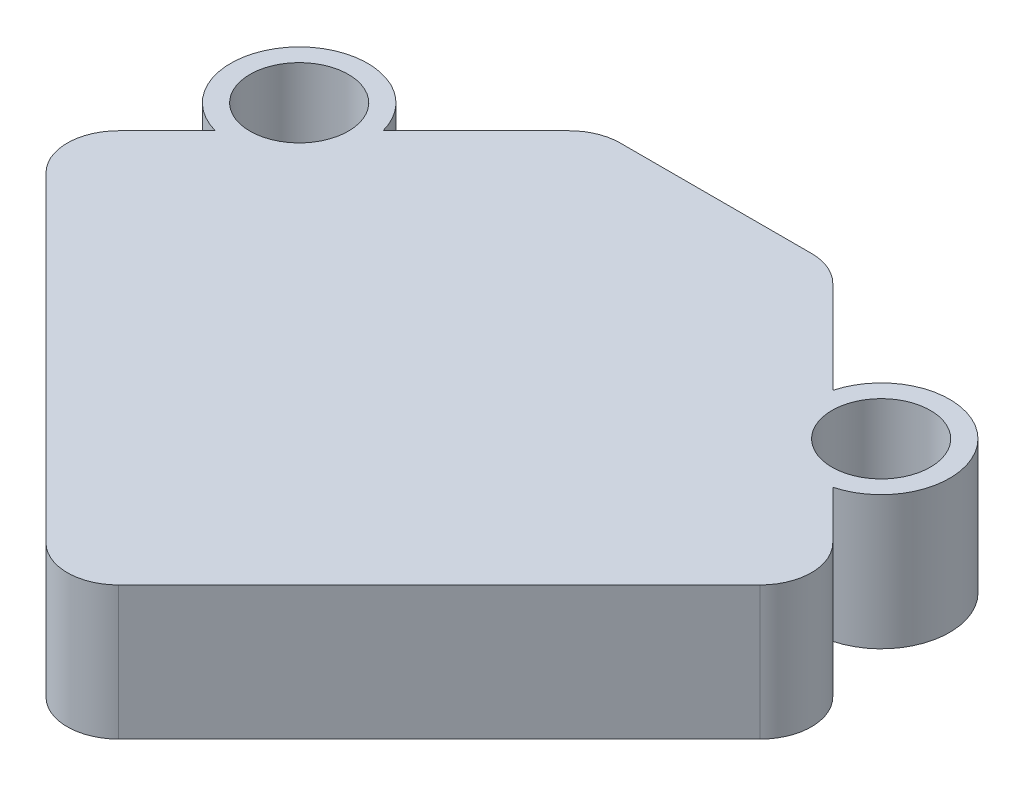
ISO-10303-21;
HEADER;
FILE_DESCRIPTION(('STEP AP214'),'2;1');
FILE_NAME('part.step','',(''),(''),'','','');
FILE_SCHEMA(('AUTOMOTIVE_DESIGN { 1 0 10303 214 1 1 1 1 }'));
ENDSEC;
DATA;
#1=APPLICATION_CONTEXT('core data for automotive mechanical design processes');
#2=APPLICATION_PROTOCOL_DEFINITION('international standard','automotive_design',2000,#1);
#3=PRODUCT_CONTEXT('',#1,'mechanical');
#4=PRODUCT('Part','Part','',(#3));
#5=PRODUCT_RELATED_PRODUCT_CATEGORY('part','',(#4));
#6=PRODUCT_DEFINITION_FORMATION('','',#4);
#7=PRODUCT_DEFINITION_CONTEXT('part definition',#1,'design');
#8=PRODUCT_DEFINITION('design','',#6,#7);
#9=PRODUCT_DEFINITION_SHAPE('','',#8);
#10=(LENGTH_UNIT() NAMED_UNIT(*) SI_UNIT(.MILLI.,.METRE.));
#11=(NAMED_UNIT(*) PLANE_ANGLE_UNIT() SI_UNIT($,.RADIAN.));
#12=(NAMED_UNIT(*) SI_UNIT($,.STERADIAN.) SOLID_ANGLE_UNIT());
#13=UNCERTAINTY_MEASURE_WITH_UNIT(LENGTH_MEASURE(1.E-05),#10,'distance_accuracy_value','');
#14=(GEOMETRIC_REPRESENTATION_CONTEXT(3) GLOBAL_UNCERTAINTY_ASSIGNED_CONTEXT((#13)) GLOBAL_UNIT_ASSIGNED_CONTEXT((#10,
#11,#12)) REPRESENTATION_CONTEXT('',''));
#15=CARTESIAN_POINT('',(0.,0.,0.));
#16=DIRECTION('',(0.,0.,1.));
#17=DIRECTION('',(1.,0.,0.));
#18=AXIS2_PLACEMENT_3D('',#15,#16,#17);
#19=CARTESIAN_POINT('',(17.,7.,-8.80939751330899));
#20=DIRECTION('',(0.,-1.,0.));
#21=DIRECTION('',(0.,0.,-1.));
#22=AXIS2_PLACEMENT_3D('',#19,#20,#21);
#23=CYLINDRICAL_SURFACE('',#22,1.75);
#24=CARTESIAN_POINT('',(17.,0.,-8.80939751330899));
#25=DIRECTION('',(0.,1.,0.));
#26=DIRECTION('',(0.,0.,1.));
#27=AXIS2_PLACEMENT_3D('',#24,#25,#26);
#28=CIRCLE('',#27,1.75);
#29=CARTESIAN_POINT('',(17.,0.,-7.05939751330899));
#30=VERTEX_POINT('',#29);
#31=EDGE_CURVE('E330',#30,#30,#28,.F.);
#32=ORIENTED_EDGE('',*,*,#31,.T.);
#33=EDGE_LOOP('',(#32));
#34=FACE_BOUND('',#33,.T.);
#35=CARTESIAN_POINT('',(17.,2.,-8.80939751330899));
#36=DIRECTION('',(0.,1.,0.));
#37=DIRECTION('',(0.,0.,1.));
#38=AXIS2_PLACEMENT_3D('',#35,#36,#37);
#39=CIRCLE('',#38,1.75);
#40=CARTESIAN_POINT('',(17.,2.,-7.05939751330899));
#41=VERTEX_POINT('',#40);
#42=EDGE_CURVE('E224',#41,#41,#39,.F.);
#43=ORIENTED_EDGE('',*,*,#42,.F.);
#44=EDGE_LOOP('',(#43));
#45=FACE_BOUND('',#44,.T.);
#46=ADVANCED_FACE('F35',(#34,#45),#23,.F.);
#47=CARTESIAN_POINT('',(-17.,7.,-8.80939751330899));
#48=DIRECTION('',(0.,-1.,0.));
#49=DIRECTION('',(0.,0.,-1.));
#50=AXIS2_PLACEMENT_3D('',#47,#48,#49);
#51=CYLINDRICAL_SURFACE('',#50,1.75);
#52=CARTESIAN_POINT('',(-17.,0.,-8.80939751330899));
#53=DIRECTION('',(0.,1.,0.));
#54=DIRECTION('',(0.,0.,1.));
#55=AXIS2_PLACEMENT_3D('',#52,#53,#54);
#56=CIRCLE('',#55,1.75);
#57=CARTESIAN_POINT('',(-17.,0.,-7.05939751330899));
#58=VERTEX_POINT('',#57);
#59=EDGE_CURVE('E239',#58,#58,#56,.T.);
#60=ORIENTED_EDGE('',*,*,#59,.F.);
#61=EDGE_LOOP('',(#60));
#62=FACE_BOUND('',#61,.T.);
#63=CARTESIAN_POINT('',(-17.,2.,-8.80939751330899));
#64=DIRECTION('',(0.,1.,0.));
#65=DIRECTION('',(0.,0.,1.));
#66=AXIS2_PLACEMENT_3D('',#63,#64,#65);
#67=CIRCLE('',#66,1.75);
#68=CARTESIAN_POINT('',(-17.,2.,-7.05939751330899));
#69=VERTEX_POINT('',#68);
#70=EDGE_CURVE('E228',#69,#69,#67,.T.);
#71=ORIENTED_EDGE('',*,*,#70,.T.);
#72=EDGE_LOOP('',(#71));
#73=FACE_BOUND('',#72,.T.);
#74=ADVANCED_FACE('F409',(#62,#73),#51,.F.);
#75=CARTESIAN_POINT('',(-10.0762716319083,7.,-10.0762716319083));
#76=DIRECTION('',(-0.707106781186548,0.,-0.707106781186547));
#77=DIRECTION('',(-0.707106781186547,0.,0.707106781186548));
#78=AXIS2_PLACEMENT_3D('',#75,#76,#77);
#79=PLANE('',#78);
#80=DIRECTION('',(0.707106781186547,0.,-0.707106781186548));
#81=VECTOR('',#80,1.);
#82=CARTESIAN_POINT('',(-10.0762716319083,0.,-10.0762716319083));
#83=LINE('',#82,#81);
#84=CARTESIAN_POINT('',(-20.1525432638166,0.,0.));
#85=VERTEX_POINT('',#84);
#86=CARTESIAN_POINT('',(-4.00000000000002,0.,-16.1525432638166));
#87=VERTEX_POINT('',#86);
#88=EDGE_CURVE('E319',#85,#87,#83,.T.);
#89=ORIENTED_EDGE('',*,*,#88,.T.);
#90=DIRECTION('',(0.,-1.,0.));
#91=VECTOR('',#90,1.);
#92=CARTESIAN_POINT('',(-4.00000000000002,-0.00100000000000013,-16.1525432638166));
#93=LINE('',#92,#91);
#94=CARTESIAN_POINT('',(-4.00000000000002,7.,-16.1525432638166));
#95=VERTEX_POINT('',#94);
#96=EDGE_CURVE('E220',#95,#87,#93,.T.);
#97=ORIENTED_EDGE('',*,*,#96,.F.);
#98=DIRECTION('',(0.707106781186547,0.,-0.707106781186548));
#99=VECTOR('',#98,1.);
#100=CARTESIAN_POINT('',(-10.0762716319083,7.,-10.0762716319083));
#101=LINE('',#100,#99);
#102=CARTESIAN_POINT('',(-20.1525432638166,7.,0.));
#103=VERTEX_POINT('',#102);
#104=EDGE_CURVE('E234',#103,#95,#101,.T.);
#105=ORIENTED_EDGE('',*,*,#104,.F.);
#106=DIRECTION('',(0.,-1.,0.));
#107=VECTOR('',#106,1.);
#108=CARTESIAN_POINT('',(-20.1525432638166,7.,0.));
#109=LINE('',#108,#107);
#110=EDGE_CURVE('E189',#103,#85,#109,.T.);
#111=ORIENTED_EDGE('',*,*,#110,.T.);
#112=EDGE_LOOP('',(#89,#97,#105,#111));
#113=FACE_BOUND('',#112,.T.);
#114=ADVANCED_FACE('F374',(#113),#79,.F.);
#115=CARTESIAN_POINT('',(10.0762716319083,7.,-10.0762716319083));
#116=DIRECTION('',(0.707106781186547,0.,-0.707106781186547));
#117=DIRECTION('',(-0.707106781186548,0.,-0.707106781186548));
#118=AXIS2_PLACEMENT_3D('',#115,#116,#117);
#119=PLANE('',#118);
#120=DIRECTION('',(0.707106781186548,0.,0.707106781186548));
#121=VECTOR('',#120,1.);
#122=CARTESIAN_POINT('',(10.0762716319083,7.,-10.0762716319083));
#123=LINE('',#122,#121);
#124=CARTESIAN_POINT('',(3.99999999999998,7.,-16.1525432638166));
#125=VERTEX_POINT('',#124);
#126=CARTESIAN_POINT('',(20.1525432638166,7.,0.));
#127=VERTEX_POINT('',#126);
#128=EDGE_CURVE('E238',#125,#127,#123,.T.);
#129=ORIENTED_EDGE('',*,*,#128,.F.);
#130=DIRECTION('',(0.,1.,0.));
#131=VECTOR('',#130,1.);
#132=CARTESIAN_POINT('',(3.99999999999998,-0.00100000000000013,-16.1525432638166));
#133=LINE('',#132,#131);
#134=CARTESIAN_POINT('',(3.99999999999998,0.,-16.1525432638166));
#135=VERTEX_POINT('',#134);
#136=EDGE_CURVE('E209',#135,#125,#133,.T.);
#137=ORIENTED_EDGE('',*,*,#136,.F.);
#138=DIRECTION('',(0.707106781186548,0.,0.707106781186548));
#139=VECTOR('',#138,1.);
#140=CARTESIAN_POINT('',(10.0762716319083,0.,-10.0762716319083));
#141=LINE('',#140,#139);
#142=CARTESIAN_POINT('',(20.1525432638166,0.,0.));
#143=VERTEX_POINT('',#142);
#144=EDGE_CURVE('E322',#135,#143,#141,.T.);
#145=ORIENTED_EDGE('',*,*,#144,.T.);
#146=DIRECTION('',(0.,-1.,0.));
#147=VECTOR('',#146,1.);
#148=CARTESIAN_POINT('',(20.1525432638166,7.,0.));
#149=LINE('',#148,#147);
#150=EDGE_CURVE('E254',#127,#143,#149,.T.);
#151=ORIENTED_EDGE('',*,*,#150,.F.);
#152=EDGE_LOOP('',(#129,#137,#145,#151));
#153=FACE_BOUND('',#152,.T.);
#154=ADVANCED_FACE('F364',(#153),#119,.F.);
#155=CARTESIAN_POINT('',(10.0762716319083,7.,10.0762716319083));
#156=DIRECTION('',(-0.707106781186548,0.,-0.707106781186548));
#157=DIRECTION('',(-0.707106781186547,0.,0.707106781186548));
#158=AXIS2_PLACEMENT_3D('',#155,#156,#157);
#159=PLANE('',#158);
#160=DIRECTION('',(0.707106781186547,0.,-0.707106781186548));
#161=VECTOR('',#160,1.);
#162=CARTESIAN_POINT('',(10.0762716319083,0.,10.0762716319083));
#163=LINE('',#162,#161);
#164=CARTESIAN_POINT('',(0.,0.,20.1525432638166));
#165=VERTEX_POINT('',#164);
#166=EDGE_CURVE('E324',#165,#143,#163,.T.);
#167=ORIENTED_EDGE('',*,*,#166,.F.);
#168=DIRECTION('',(0.,-1.,0.));
#169=VECTOR('',#168,1.);
#170=CARTESIAN_POINT('',(0.,7.,20.1525432638166));
#171=LINE('',#170,#169);
#172=CARTESIAN_POINT('',(0.,7.,20.1525432638166));
#173=VERTEX_POINT('',#172);
#174=EDGE_CURVE('E336',#173,#165,#171,.T.);
#175=ORIENTED_EDGE('',*,*,#174,.F.);
#176=DIRECTION('',(0.707106781186547,0.,-0.707106781186548));
#177=VECTOR('',#176,1.);
#178=CARTESIAN_POINT('',(10.0762716319083,7.,10.0762716319083));
#179=LINE('',#178,#177);
#180=EDGE_CURVE('E231',#173,#127,#179,.T.);
#181=ORIENTED_EDGE('',*,*,#180,.T.);
#182=ORIENTED_EDGE('',*,*,#150,.T.);
#183=EDGE_LOOP('',(#167,#175,#181,#182));
#184=FACE_BOUND('',#183,.T.);
#185=ADVANCED_FACE('F357',(#184),#159,.T.);
#186=CARTESIAN_POINT('',(-11.4904851942814,7.,-11.4904851942814));
#187=DIRECTION('',(-0.707106781186548,0.,-0.707106781186547));
#188=DIRECTION('',(-0.707106781186547,0.,0.707106781186548));
#189=AXIS2_PLACEMENT_3D('',#186,#187,#188);
#190=PLANE('',#189);
#191=DIRECTION('',(-0.707106781186547,0.,0.707106781186548));
#192=VECTOR('',#191,1.);
#193=CARTESIAN_POINT('',(-11.4904851942814,7.8,-11.4904851942814));
#194=LINE('',#193,#192);
#195=CARTESIAN_POINT('',(-7.70710678118656,7.8,-15.2738636073762));
#196=VERTEX_POINT('',#195);
#197=CARTESIAN_POINT('',(-13.1362966948437,7.8,-9.84467369371908));
#198=VERTEX_POINT('',#197);
#199=EDGE_CURVE('E166',#196,#198,#194,.T.);
#200=ORIENTED_EDGE('',*,*,#199,.F.);
#201=DIRECTION('',(0.,-1.,0.));
#202=VECTOR('',#201,1.);
#203=CARTESIAN_POINT('',(-7.70710678118656,0.,-15.2738636073762));
#204=LINE('',#203,#202);
#205=CARTESIAN_POINT('',(-7.70710678118656,0.,-15.2738636073762));
#206=VERTEX_POINT('',#205);
#207=EDGE_CURVE('E251',#196,#206,#204,.T.);
#208=ORIENTED_EDGE('',*,*,#207,.T.);
#209=DIRECTION('',(0.707106781186547,0.,-0.707106781186548));
#210=VECTOR('',#209,1.);
#211=CARTESIAN_POINT('',(-11.4904851942814,0.,-11.4904851942814));
#212=LINE('',#211,#210);
#213=CARTESIAN_POINT('',(-13.1362966948437,0.,-9.84467369371908));
#214=VERTEX_POINT('',#213);
#215=EDGE_CURVE('E185',#214,#206,#212,.T.);
#216=ORIENTED_EDGE('',*,*,#215,.F.);
#217=DIRECTION('',(0.,-1.,0.));
#218=VECTOR('',#217,1.);
#219=CARTESIAN_POINT('',(-13.1362966948437,7.,-9.84467369371908));
#220=LINE('',#219,#218);
#221=EDGE_CURVE('E182',#198,#214,#220,.T.);
#222=ORIENTED_EDGE('',*,*,#221,.F.);
#223=EDGE_LOOP('',(#200,#208,#216,#222));
#224=FACE_BOUND('',#223,.T.);
#225=ADVANCED_FACE('F183',(#224),#190,.T.);
#226=CARTESIAN_POINT('',(-17.,7.,-8.80939751330899));
#227=DIRECTION('',(0.,-1.,0.));
#228=DIRECTION('',(0.,0.,-1.));
#229=AXIS2_PLACEMENT_3D('',#226,#227,#228);
#230=CYLINDRICAL_SURFACE('',#229,3.99999999999999);
#231=CARTESIAN_POINT('',(-17.,0.,-8.80939751330899));
#232=DIRECTION('',(0.,1.,0.));
#233=DIRECTION('',(0.,0.,1.));
#234=AXIS2_PLACEMENT_3D('',#231,#232,#233);
#235=CIRCLE('',#234,3.99999999999999);
#236=CARTESIAN_POINT('',(-18.0352761804101,0.,-4.94569420815272));
#237=VERTEX_POINT('',#236);
#238=EDGE_CURVE('E308',#214,#237,#235,.T.);
#239=ORIENTED_EDGE('',*,*,#238,.T.);
#240=DIRECTION('',(0.,-1.,0.));
#241=VECTOR('',#240,1.);
#242=CARTESIAN_POINT('',(-18.0352761804101,7.,-4.94569420815272));
#243=LINE('',#242,#241);
#244=CARTESIAN_POINT('',(-18.0352761804101,7.8,-4.94569420815272));
#245=VERTEX_POINT('',#244);
#246=EDGE_CURVE('E190',#245,#237,#243,.T.);
#247=ORIENTED_EDGE('',*,*,#246,.F.);
#248=CARTESIAN_POINT('',(-17.,7.8,-8.80939751330899));
#249=DIRECTION('',(0.,1.,0.));
#250=DIRECTION('',(0.,0.,1.));
#251=AXIS2_PLACEMENT_3D('',#248,#249,#250);
#252=CIRCLE('',#251,3.99999999999999);
#253=EDGE_CURVE('E172',#198,#245,#252,.T.);
#254=ORIENTED_EDGE('',*,*,#253,.F.);
#255=ORIENTED_EDGE('',*,*,#221,.T.);
#256=EDGE_LOOP('',(#239,#247,#254,#255));
#257=FACE_BOUND('',#256,.T.);
#258=ADVANCED_FACE('F192',(#257),#230,.T.);
#259=CARTESIAN_POINT('',(-11.4904851942814,7.,-11.4904851942814));
#260=DIRECTION('',(-0.707106781186548,0.,-0.707106781186547));
#261=DIRECTION('',(-0.707106781186547,0.,0.707106781186548));
#262=AXIS2_PLACEMENT_3D('',#259,#260,#261);
#263=PLANE('',#262);
#264=DIRECTION('',(0.707106781186547,0.,-0.707106781186548));
#265=VECTOR('',#264,1.);
#266=CARTESIAN_POINT('',(-11.4904851942814,0.,-11.4904851942814));
#267=LINE('',#266,#265);
#268=CARTESIAN_POINT('',(-20.8596500450032,0.,-2.12132034355964));
#269=VERTEX_POINT('',#268);
#270=EDGE_CURVE('E304',#269,#237,#267,.T.);
#271=ORIENTED_EDGE('',*,*,#270,.F.);
#272=DIRECTION('',(0.,-1.,0.));
#273=VECTOR('',#272,1.);
#274=CARTESIAN_POINT('',(-20.8596500450032,7.8,-2.12132034355964));
#275=LINE('',#274,#273);
#276=CARTESIAN_POINT('',(-20.8596500450032,7.8,-2.12132034355964));
#277=VERTEX_POINT('',#276);
#278=EDGE_CURVE('E12',#269,#277,#275,.F.);
#279=ORIENTED_EDGE('',*,*,#278,.T.);
#280=DIRECTION('',(-0.707106781186547,0.,0.707106781186548));
#281=VECTOR('',#280,1.);
#282=CARTESIAN_POINT('',(-11.4904851942814,7.8,-11.4904851942814));
#283=LINE('',#282,#281);
#284=EDGE_CURVE('E194',#245,#277,#283,.T.);
#285=ORIENTED_EDGE('',*,*,#284,.F.);
#286=ORIENTED_EDGE('',*,*,#246,.T.);
#287=EDGE_LOOP('',(#271,#279,#285,#286));
#288=FACE_BOUND('',#287,.T.);
#289=ADVANCED_FACE('F439',(#288),#263,.T.);
#290=CARTESIAN_POINT('',(-11.4904851942814,7.,11.4904851942814));
#291=DIRECTION('',(0.707106781186547,0.,-0.707106781186547));
#292=DIRECTION('',(-0.707106781186548,0.,-0.707106781186548));
#293=AXIS2_PLACEMENT_3D('',#290,#291,#292);
#294=PLANE('',#293);
#295=DIRECTION('',(0.707106781186548,0.,0.707106781186548));
#296=VECTOR('',#295,1.);
#297=CARTESIAN_POINT('',(-11.4904851942814,7.8,11.4904851942814));
#298=LINE('',#297,#296);
#299=CARTESIAN_POINT('',(-20.8596500450032,7.8,2.12132034355964));
#300=VERTEX_POINT('',#299);
#301=CARTESIAN_POINT('',(-2.12132034355963,7.8,20.8596500450032));
#302=VERTEX_POINT('',#301);
#303=EDGE_CURVE('E196',#300,#302,#298,.T.);
#304=ORIENTED_EDGE('',*,*,#303,.F.);
#305=DIRECTION('',(0.,-1.,0.));
#306=VECTOR('',#305,1.);
#307=CARTESIAN_POINT('',(-20.8596500450032,0.,2.12132034355964));
#308=LINE('',#307,#306);
#309=CARTESIAN_POINT('',(-20.8596500450032,0.,2.12132034355964));
#310=VERTEX_POINT('',#309);
#311=EDGE_CURVE('E43',#300,#310,#308,.T.);
#312=ORIENTED_EDGE('',*,*,#311,.T.);
#313=DIRECTION('',(0.707106781186548,0.,0.707106781186548));
#314=VECTOR('',#313,1.);
#315=CARTESIAN_POINT('',(-11.4904851942814,0.,11.4904851942814));
#316=LINE('',#315,#314);
#317=CARTESIAN_POINT('',(-2.12132034355963,0.,20.8596500450032));
#318=VERTEX_POINT('',#317);
#319=EDGE_CURVE('E294',#310,#318,#316,.T.);
#320=ORIENTED_EDGE('',*,*,#319,.T.);
#321=DIRECTION('',(0.,-1.,0.));
#322=VECTOR('',#321,1.);
#323=CARTESIAN_POINT('',(-2.12132034355963,7.,20.8596500450032));
#324=LINE('',#323,#322);
#325=EDGE_CURVE('E286',#318,#302,#324,.F.);
#326=ORIENTED_EDGE('',*,*,#325,.T.);
#327=EDGE_LOOP('',(#304,#312,#320,#326));
#328=FACE_BOUND('',#327,.T.);
#329=ADVANCED_FACE('F293',(#328),#294,.F.);
#330=CARTESIAN_POINT('',(11.4904851942814,7.,11.4904851942814));
#331=DIRECTION('',(-0.707106781186548,0.,-0.707106781186548));
#332=DIRECTION('',(-0.707106781186547,0.,0.707106781186548));
#333=AXIS2_PLACEMENT_3D('',#330,#331,#332);
#334=PLANE('',#333);
#335=DIRECTION('',(0.707106781186547,0.,-0.707106781186548));
#336=VECTOR('',#335,1.);
#337=CARTESIAN_POINT('',(11.4904851942814,0.,11.4904851942814));
#338=LINE('',#337,#336);
#339=CARTESIAN_POINT('',(2.12132034355965,0.,20.8596500450032));
#340=VERTEX_POINT('',#339);
#341=CARTESIAN_POINT('',(20.8596500450032,0.,2.12132034355965));
#342=VERTEX_POINT('',#341);
#343=EDGE_CURVE('E303',#340,#342,#338,.T.);
#344=ORIENTED_EDGE('',*,*,#343,.T.);
#345=DIRECTION('',(0.,-1.,0.));
#346=VECTOR('',#345,1.);
#347=CARTESIAN_POINT('',(20.8596500450032,7.8,2.12132034355965));
#348=LINE('',#347,#346);
#349=CARTESIAN_POINT('',(20.8596500450032,7.8,2.12132034355965));
#350=VERTEX_POINT('',#349);
#351=EDGE_CURVE('E58',#342,#350,#348,.F.);
#352=ORIENTED_EDGE('',*,*,#351,.T.);
#353=DIRECTION('',(0.707106781186548,0.,-0.707106781186548));
#354=VECTOR('',#353,1.);
#355=CARTESIAN_POINT('',(11.4904851942814,7.8,11.4904851942814));
#356=LINE('',#355,#354);
#357=CARTESIAN_POINT('',(2.12132034355965,7.8,20.8596500450032));
#358=VERTEX_POINT('',#357);
#359=EDGE_CURVE('E202',#358,#350,#356,.T.);
#360=ORIENTED_EDGE('',*,*,#359,.F.);
#361=DIRECTION('',(0.,-1.,0.));
#362=VECTOR('',#361,1.);
#363=CARTESIAN_POINT('',(2.12132034355965,7.,20.8596500450032));
#364=LINE('',#363,#362);
#365=EDGE_CURVE('E282',#358,#340,#364,.T.);
#366=ORIENTED_EDGE('',*,*,#365,.T.);
#367=EDGE_LOOP('',(#344,#352,#360,#366));
#368=FACE_BOUND('',#367,.T.);
#369=ADVANCED_FACE('F434',(#368),#334,.F.);
#370=CARTESIAN_POINT('',(11.4904851942814,7.,-11.4904851942814));
#371=DIRECTION('',(0.707106781186547,0.,-0.707106781186548));
#372=DIRECTION('',(-0.707106781186548,0.,-0.707106781186547));
#373=AXIS2_PLACEMENT_3D('',#370,#371,#372);
#374=PLANE('',#373);
#375=DIRECTION('',(-0.707106781186548,0.,-0.707106781186547));
#376=VECTOR('',#375,1.);
#377=CARTESIAN_POINT('',(11.4904851942814,7.8,-11.4904851942814));
#378=LINE('',#377,#376);
#379=CARTESIAN_POINT('',(20.8596500450032,7.8,-2.12132034355964));
#380=VERTEX_POINT('',#379);
#381=CARTESIAN_POINT('',(18.0352761804101,7.8,-4.94569420815272));
#382=VERTEX_POINT('',#381);
#383=EDGE_CURVE('E204',#380,#382,#378,.T.);
#384=ORIENTED_EDGE('',*,*,#383,.F.);
#385=DIRECTION('',(0.,-1.,0.));
#386=VECTOR('',#385,1.);
#387=CARTESIAN_POINT('',(20.8596500450032,0.,-2.12132034355964));
#388=LINE('',#387,#386);
#389=CARTESIAN_POINT('',(20.8596500450032,0.,-2.12132034355964));
#390=VERTEX_POINT('',#389);
#391=EDGE_CURVE('E279',#380,#390,#388,.T.);
#392=ORIENTED_EDGE('',*,*,#391,.T.);
#393=DIRECTION('',(0.707106781186548,0.,0.707106781186547));
#394=VECTOR('',#393,1.);
#395=CARTESIAN_POINT('',(11.4904851942814,0.,-11.4904851942814));
#396=LINE('',#395,#394);
#397=CARTESIAN_POINT('',(18.0352761804101,0.,-4.94569420815272));
#398=VERTEX_POINT('',#397);
#399=EDGE_CURVE('E306',#398,#390,#396,.T.);
#400=ORIENTED_EDGE('',*,*,#399,.F.);
#401=DIRECTION('',(0.,-1.,0.));
#402=VECTOR('',#401,1.);
#403=CARTESIAN_POINT('',(18.0352761804101,7.,-4.94569420815272));
#404=LINE('',#403,#402);
#405=EDGE_CURVE('E343',#382,#398,#404,.T.);
#406=ORIENTED_EDGE('',*,*,#405,.F.);
#407=EDGE_LOOP('',(#384,#392,#400,#406));
#408=FACE_BOUND('',#407,.T.);
#409=ADVANCED_FACE('F395',(#408),#374,.T.);
#410=CARTESIAN_POINT('',(17.,7.,-8.80939751330899));
#411=DIRECTION('',(0.,-1.,0.));
#412=DIRECTION('',(0.,0.,-1.));
#413=AXIS2_PLACEMENT_3D('',#410,#411,#412);
#414=CYLINDRICAL_SURFACE('',#413,3.99999999999999);
#415=CARTESIAN_POINT('',(17.,0.,-8.80939751330899));
#416=DIRECTION('',(0.,1.,0.));
#417=DIRECTION('',(0.,0.,1.));
#418=AXIS2_PLACEMENT_3D('',#415,#416,#417);
#419=CIRCLE('',#418,3.99999999999999);
#420=CARTESIAN_POINT('',(13.1362966948437,0.,-9.84467369371907));
#421=VERTEX_POINT('',#420);
#422=EDGE_CURVE('E314',#421,#398,#419,.F.);
#423=ORIENTED_EDGE('',*,*,#422,.F.);
#424=DIRECTION('',(0.,-1.,0.));
#425=VECTOR('',#424,1.);
#426=CARTESIAN_POINT('',(13.1362966948437,7.,-9.84467369371907));
#427=LINE('',#426,#425);
#428=CARTESIAN_POINT('',(13.1362966948437,7.8,-9.84467369371907));
#429=VERTEX_POINT('',#428);
#430=EDGE_CURVE('E340',#429,#421,#427,.T.);
#431=ORIENTED_EDGE('',*,*,#430,.F.);
#432=CARTESIAN_POINT('',(17.,7.8,-8.80939751330899));
#433=DIRECTION('',(0.,1.,0.));
#434=DIRECTION('',(0.,0.,1.));
#435=AXIS2_PLACEMENT_3D('',#432,#433,#434);
#436=CIRCLE('',#435,3.99999999999999);
#437=EDGE_CURVE('E206',#382,#429,#436,.T.);
#438=ORIENTED_EDGE('',*,*,#437,.F.);
#439=ORIENTED_EDGE('',*,*,#405,.T.);
#440=EDGE_LOOP('',(#423,#431,#438,#439));
#441=FACE_BOUND('',#440,.T.);
#442=ADVANCED_FACE('F391',(#441),#414,.T.);
#443=CARTESIAN_POINT('',(-10.0762716319083,7.,10.0762716319083));
#444=DIRECTION('',(0.707106781186547,0.,-0.707106781186548));
#445=DIRECTION('',(-0.707106781186548,0.,-0.707106781186547));
#446=AXIS2_PLACEMENT_3D('',#443,#444,#445);
#447=PLANE('',#446);
#448=DIRECTION('',(0.707106781186548,0.,0.707106781186547));
#449=VECTOR('',#448,1.);
#450=CARTESIAN_POINT('',(-10.0762716319083,0.,10.0762716319083));
#451=LINE('',#450,#449);
#452=EDGE_CURVE('E327',#85,#165,#451,.T.);
#453=ORIENTED_EDGE('',*,*,#452,.F.);
#454=ORIENTED_EDGE('',*,*,#110,.F.);
#455=DIRECTION('',(0.707106781186548,0.,0.707106781186547));
#456=VECTOR('',#455,1.);
#457=CARTESIAN_POINT('',(-10.0762716319083,7.,10.0762716319083));
#458=LINE('',#457,#456);
#459=EDGE_CURVE('E344',#103,#173,#458,.T.);
#460=ORIENTED_EDGE('',*,*,#459,.T.);
#461=ORIENTED_EDGE('',*,*,#174,.T.);
#462=EDGE_LOOP('',(#453,#454,#460,#461));
#463=FACE_BOUND('',#462,.T.);
#464=ADVANCED_FACE('F371',(#463),#447,.T.);
#465=CARTESIAN_POINT('',(11.4904851942814,7.,-11.4904851942814));
#466=DIRECTION('',(0.707106781186547,0.,-0.707106781186548));
#467=DIRECTION('',(-0.707106781186548,0.,-0.707106781186547));
#468=AXIS2_PLACEMENT_3D('',#465,#466,#467);
#469=PLANE('',#468);
#470=DIRECTION('',(0.707106781186548,0.,0.707106781186547));
#471=VECTOR('',#470,1.);
#472=CARTESIAN_POINT('',(11.4904851942814,0.,-11.4904851942814));
#473=LINE('',#472,#471);
#474=CARTESIAN_POINT('',(7.70710678118655,0.,-15.2738636073763));
#475=VERTEX_POINT('',#474);
#476=EDGE_CURVE('E317',#475,#421,#473,.T.);
#477=ORIENTED_EDGE('',*,*,#476,.F.);
#478=DIRECTION('',(0.,1.,0.));
#479=VECTOR('',#478,1.);
#480=CARTESIAN_POINT('',(7.70710678118655,7.8,-15.2738636073763));
#481=LINE('',#480,#479);
#482=CARTESIAN_POINT('',(7.70710678118655,7.8,-15.2738636073763));
#483=VERTEX_POINT('',#482);
#484=EDGE_CURVE('E276',#475,#483,#481,.T.);
#485=ORIENTED_EDGE('',*,*,#484,.T.);
#486=DIRECTION('',(-0.707106781186548,0.,-0.707106781186547));
#487=VECTOR('',#486,1.);
#488=CARTESIAN_POINT('',(11.4904851942814,7.8,-11.4904851942814));
#489=LINE('',#488,#487);
#490=EDGE_CURVE('E388',#429,#483,#489,.T.);
#491=ORIENTED_EDGE('',*,*,#490,.F.);
#492=ORIENTED_EDGE('',*,*,#430,.T.);
#493=EDGE_LOOP('',(#477,#485,#491,#492));
#494=FACE_BOUND('',#493,.T.);
#495=ADVANCED_FACE('F384',(#494),#469,.T.);
#496=CARTESIAN_POINT('',(0.,0.,0.));
#497=DIRECTION('',(0.,1.,0.));
#498=DIRECTION('',(0.,0.,1.));
#499=AXIS2_PLACEMENT_3D('',#496,#497,#498);
#500=PLANE('',#499);
#501=ORIENTED_EDGE('',*,*,#215,.T.);
#502=CARTESIAN_POINT('',(-5.58578643762692,0.,-13.1525432638166));
#503=DIRECTION('',(0.,1.,0.));
#504=DIRECTION('',(0.,0.,1.));
#505=AXIS2_PLACEMENT_3D('',#502,#503,#504);
#506=CIRCLE('',#505,3.);
#507=CARTESIAN_POINT('',(-5.58578643762692,0.,-16.1525432638166));
#508=VERTEX_POINT('',#507);
#509=EDGE_CURVE('E262',#206,#508,#506,.F.);
#510=ORIENTED_EDGE('',*,*,#509,.T.);
#511=DIRECTION('',(-1.,0.,0.));
#512=VECTOR('',#511,1.);
#513=CARTESIAN_POINT('',(-6.8284271247462,0.,-16.1525432638166));
#514=LINE('',#513,#512);
#515=EDGE_CURVE('E216',#87,#508,#514,.T.);
#516=ORIENTED_EDGE('',*,*,#515,.F.);
#517=ORIENTED_EDGE('',*,*,#88,.F.);
#518=ORIENTED_EDGE('',*,*,#452,.T.);
#519=ORIENTED_EDGE('',*,*,#166,.T.);
#520=ORIENTED_EDGE('',*,*,#144,.F.);
#521=CARTESIAN_POINT('',(5.5857864376269,0.,-16.1525432638166));
#522=VERTEX_POINT('',#521);
#523=EDGE_CURVE('E219',#522,#135,#514,.T.);
#524=ORIENTED_EDGE('',*,*,#523,.F.);
#525=CARTESIAN_POINT('',(5.5857864376269,0.,-13.1525432638166));
#526=DIRECTION('',(0.,1.,0.));
#527=DIRECTION('',(0.,0.,1.));
#528=AXIS2_PLACEMENT_3D('',#525,#526,#527);
#529=CIRCLE('',#528,3.);
#530=EDGE_CURVE('E260',#522,#475,#529,.F.);
#531=ORIENTED_EDGE('',*,*,#530,.T.);
#532=ORIENTED_EDGE('',*,*,#476,.T.);
#533=ORIENTED_EDGE('',*,*,#422,.T.);
#534=ORIENTED_EDGE('',*,*,#399,.T.);
#535=CARTESIAN_POINT('',(18.7383297014435,0.,0.));
#536=DIRECTION('',(0.,1.,0.));
#537=DIRECTION('',(0.,0.,1.));
#538=AXIS2_PLACEMENT_3D('',#535,#536,#537);
#539=CIRCLE('',#538,3.);
#540=EDGE_CURVE('E258',#390,#342,#539,.F.);
#541=ORIENTED_EDGE('',*,*,#540,.T.);
#542=ORIENTED_EDGE('',*,*,#343,.F.);
#543=CARTESIAN_POINT('',(0.,0.,18.7383297014435));
#544=DIRECTION('',(0.,1.,0.));
#545=DIRECTION('',(0.,0.,1.));
#546=AXIS2_PLACEMENT_3D('',#543,#544,#545);
#547=CIRCLE('',#546,3.);
#548=EDGE_CURVE('E253',#340,#318,#547,.F.);
#549=ORIENTED_EDGE('',*,*,#548,.T.);
#550=ORIENTED_EDGE('',*,*,#319,.F.);
#551=CARTESIAN_POINT('',(-18.7383297014435,0.,0.));
#552=DIRECTION('',(0.,1.,0.));
#553=DIRECTION('',(0.,0.,1.));
#554=AXIS2_PLACEMENT_3D('',#551,#552,#553);
#555=CIRCLE('',#554,3.);
#556=EDGE_CURVE('E256',#310,#269,#555,.F.);
#557=ORIENTED_EDGE('',*,*,#556,.T.);
#558=ORIENTED_EDGE('',*,*,#270,.T.);
#559=ORIENTED_EDGE('',*,*,#238,.F.);
#560=EDGE_LOOP('',(#501,#510,#516,#517,#518,#519,#520,#524,#531,#532,#533,#534,#541,#542,#549,
#550,#557,#558,#559));
#561=FACE_BOUND('',#560,.T.);
#562=ORIENTED_EDGE('',*,*,#31,.F.);
#563=EDGE_LOOP('',(#562));
#564=FACE_BOUND('',#563,.T.);
#565=ORIENTED_EDGE('',*,*,#59,.T.);
#566=EDGE_LOOP('',(#565));
#567=FACE_BOUND('',#566,.T.);
#568=ADVANCED_FACE('F299',(#561,#564,#567),#500,.F.);
#569=CARTESIAN_POINT('',(-17.,-8.13172798364529,-8.80939751330899));
#570=DIRECTION('',(0.,1.,0.));
#571=DIRECTION('',(0.,0.,1.));
#572=AXIS2_PLACEMENT_3D('',#569,#570,#571);
#573=CYLINDRICAL_SURFACE('',#572,2.875);
#574=CARTESIAN_POINT('',(-17.,2.,-8.80939751330899));
#575=DIRECTION('',(0.,1.,0.));
#576=DIRECTION('',(0.,0.,1.));
#577=AXIS2_PLACEMENT_3D('',#574,#575,#576);
#578=CIRCLE('',#577,2.875);
#579=CARTESIAN_POINT('',(-17.,2.,-5.93439751330899));
#580=VERTEX_POINT('',#579);
#581=EDGE_CURVE('E225',#580,#580,#578,.F.);
#582=ORIENTED_EDGE('',*,*,#581,.T.);
#583=EDGE_LOOP('',(#582));
#584=FACE_BOUND('',#583,.T.);
#585=CARTESIAN_POINT('',(-17.,7.8,-8.80939751330899));
#586=DIRECTION('',(0.,1.,0.));
#587=DIRECTION('',(0.,0.,1.));
#588=AXIS2_PLACEMENT_3D('',#585,#586,#587);
#589=CIRCLE('',#588,2.875);
#590=CARTESIAN_POINT('',(-17.,7.8,-5.93439751330899));
#591=VERTEX_POINT('',#590);
#592=EDGE_CURVE('E455',#591,#591,#589,.F.);
#593=ORIENTED_EDGE('',*,*,#592,.F.);
#594=EDGE_LOOP('',(#593));
#595=FACE_BOUND('',#594,.T.);
#596=ADVANCED_FACE('F480',(#584,#595),#573,.F.);
#597=CARTESIAN_POINT('',(0.,2.,0.));
#598=DIRECTION('',(0.,1.,0.));
#599=DIRECTION('',(0.,0.,1.));
#600=AXIS2_PLACEMENT_3D('',#597,#598,#599);
#601=PLANE('',#600);
#602=ORIENTED_EDGE('',*,*,#70,.F.);
#603=EDGE_LOOP('',(#602));
#604=FACE_BOUND('',#603,.T.);
#605=ORIENTED_EDGE('',*,*,#581,.F.);
#606=EDGE_LOOP('',(#605));
#607=FACE_BOUND('',#606,.T.);
#608=ADVANCED_FACE('F474',(#604,#607),#601,.T.);
#609=CARTESIAN_POINT('',(0.,2.,0.));
#610=DIRECTION('',(0.,1.,0.));
#611=DIRECTION('',(0.,0.,1.));
#612=AXIS2_PLACEMENT_3D('',#609,#610,#611);
#613=PLANE('',#612);
#614=CARTESIAN_POINT('',(17.,2.,-8.80939751330899));
#615=DIRECTION('',(0.,1.,0.));
#616=DIRECTION('',(0.,0.,1.));
#617=AXIS2_PLACEMENT_3D('',#614,#615,#616);
#618=CIRCLE('',#617,2.875);
#619=CARTESIAN_POINT('',(17.,2.,-5.93439751330899));
#620=VERTEX_POINT('',#619);
#621=EDGE_CURVE('E221',#620,#620,#618,.F.);
#622=ORIENTED_EDGE('',*,*,#621,.F.);
#623=EDGE_LOOP('',(#622));
#624=FACE_BOUND('',#623,.T.);
#625=ORIENTED_EDGE('',*,*,#42,.T.);
#626=EDGE_LOOP('',(#625));
#627=FACE_BOUND('',#626,.T.);
#628=ADVANCED_FACE('F466',(#624,#627),#613,.T.);
#629=CARTESIAN_POINT('',(17.,-8.13172798364529,-8.80939751330899));
#630=DIRECTION('',(0.,1.,0.));
#631=DIRECTION('',(0.,0.,1.));
#632=AXIS2_PLACEMENT_3D('',#629,#630,#631);
#633=CYLINDRICAL_SURFACE('',#632,2.875);
#634=ORIENTED_EDGE('',*,*,#621,.T.);
#635=EDGE_LOOP('',(#634));
#636=FACE_BOUND('',#635,.T.);
#637=CARTESIAN_POINT('',(17.,7.8,-8.80939751330899));
#638=DIRECTION('',(0.,1.,0.));
#639=DIRECTION('',(0.,0.,1.));
#640=AXIS2_PLACEMENT_3D('',#637,#638,#639);
#641=CIRCLE('',#640,2.875);
#642=CARTESIAN_POINT('',(17.,7.8,-5.93439751330899));
#643=VERTEX_POINT('',#642);
#644=EDGE_CURVE('E215',#643,#643,#641,.F.);
#645=ORIENTED_EDGE('',*,*,#644,.F.);
#646=EDGE_LOOP('',(#645));
#647=FACE_BOUND('',#646,.T.);
#648=ADVANCED_FACE('F464',(#636,#647),#633,.F.);
#649=CARTESIAN_POINT('',(-6.8284271247462,-0.00100000000000013,-16.1525432638166));
#650=DIRECTION('',(0.,0.,1.));
#651=DIRECTION('',(1.,0.,0.));
#652=AXIS2_PLACEMENT_3D('',#649,#650,#651);
#653=PLANE('',#652);
#654=ORIENTED_EDGE('',*,*,#515,.T.);
#655=DIRECTION('',(0.,-1.,0.));
#656=VECTOR('',#655,1.);
#657=CARTESIAN_POINT('',(-5.58578643762692,7.8,-16.1525432638166));
#658=LINE('',#657,#656);
#659=CARTESIAN_POINT('',(-5.58578643762692,7.8,-16.1525432638166));
#660=VERTEX_POINT('',#659);
#661=EDGE_CURVE('E266',#508,#660,#658,.F.);
#662=ORIENTED_EDGE('',*,*,#661,.T.);
#663=DIRECTION('',(-1.,0.,0.));
#664=VECTOR('',#663,1.);
#665=CARTESIAN_POINT('',(0.,7.8,-16.1525432638166));
#666=LINE('',#665,#664);
#667=CARTESIAN_POINT('',(5.5857864376269,7.8,-16.1525432638166));
#668=VERTEX_POINT('',#667);
#669=EDGE_CURVE('E179',#668,#660,#666,.T.);
#670=ORIENTED_EDGE('',*,*,#669,.F.);
#671=DIRECTION('',(0.,1.,0.));
#672=VECTOR('',#671,1.);
#673=CARTESIAN_POINT('',(5.5857864376269,0.,-16.1525432638166));
#674=LINE('',#673,#672);
#675=EDGE_CURVE('E264',#668,#522,#674,.F.);
#676=ORIENTED_EDGE('',*,*,#675,.T.);
#677=ORIENTED_EDGE('',*,*,#523,.T.);
#678=ORIENTED_EDGE('',*,*,#136,.T.);
#679=DIRECTION('',(-1.,0.,0.));
#680=VECTOR('',#679,1.);
#681=CARTESIAN_POINT('',(0.,7.,-16.1525432638166));
#682=LINE('',#681,#680);
#683=EDGE_CURVE('E212',#125,#95,#682,.T.);
#684=ORIENTED_EDGE('',*,*,#683,.T.);
#685=ORIENTED_EDGE('',*,*,#96,.T.);
#686=EDGE_LOOP('',(#654,#662,#670,#676,#677,#678,#684,#685));
#687=FACE_BOUND('',#686,.T.);
#688=ADVANCED_FACE('F376',(#687),#653,.F.);
#689=CARTESIAN_POINT('',(0.,7.,0.));
#690=DIRECTION('',(0.,1.,0.));
#691=DIRECTION('',(0.,0.,1.));
#692=AXIS2_PLACEMENT_3D('',#689,#690,#691);
#693=PLANE('',#692);
#694=ORIENTED_EDGE('',*,*,#683,.F.);
#695=ORIENTED_EDGE('',*,*,#128,.T.);
#696=ORIENTED_EDGE('',*,*,#180,.F.);
#697=ORIENTED_EDGE('',*,*,#459,.F.);
#698=ORIENTED_EDGE('',*,*,#104,.T.);
#699=EDGE_LOOP('',(#694,#695,#696,#697,#698));
#700=FACE_BOUND('',#699,.T.);
#701=ADVANCED_FACE('F361',(#700),#693,.F.);
#702=CARTESIAN_POINT('',(0.,7.8,0.));
#703=DIRECTION('',(0.,1.,0.));
#704=DIRECTION('',(0.,0.,1.));
#705=AXIS2_PLACEMENT_3D('',#702,#703,#704);
#706=PLANE('',#705);
#707=ORIENTED_EDGE('',*,*,#644,.T.);
#708=EDGE_LOOP('',(#707));
#709=FACE_BOUND('',#708,.T.);
#710=ORIENTED_EDGE('',*,*,#592,.T.);
#711=EDGE_LOOP('',(#710));
#712=FACE_BOUND('',#711,.T.);
#713=ORIENTED_EDGE('',*,*,#669,.T.);
#714=CARTESIAN_POINT('',(-5.58578643762692,7.8,-13.1525432638166));
#715=DIRECTION('',(0.,1.,0.));
#716=DIRECTION('',(0.,0.,1.));
#717=AXIS2_PLACEMENT_3D('',#714,#715,#716);
#718=CIRCLE('',#717,3.);
#719=EDGE_CURVE('E175',#660,#196,#718,.T.);
#720=ORIENTED_EDGE('',*,*,#719,.T.);
#721=ORIENTED_EDGE('',*,*,#199,.T.);
#722=ORIENTED_EDGE('',*,*,#253,.T.);
#723=ORIENTED_EDGE('',*,*,#284,.T.);
#724=CARTESIAN_POINT('',(-18.7383297014435,7.8,0.));
#725=DIRECTION('',(0.,1.,0.));
#726=DIRECTION('',(0.,0.,1.));
#727=AXIS2_PLACEMENT_3D('',#724,#725,#726);
#728=CIRCLE('',#727,3.);
#729=EDGE_CURVE('E270',#277,#300,#728,.T.);
#730=ORIENTED_EDGE('',*,*,#729,.T.);
#731=ORIENTED_EDGE('',*,*,#303,.T.);
#732=CARTESIAN_POINT('',(0.,7.8,18.7383297014435));
#733=DIRECTION('',(0.,1.,0.));
#734=DIRECTION('',(0.,0.,1.));
#735=AXIS2_PLACEMENT_3D('',#732,#733,#734);
#736=CIRCLE('',#735,3.);
#737=EDGE_CURVE('E268',#302,#358,#736,.T.);
#738=ORIENTED_EDGE('',*,*,#737,.T.);
#739=ORIENTED_EDGE('',*,*,#359,.T.);
#740=CARTESIAN_POINT('',(18.7383297014435,7.8,0.));
#741=DIRECTION('',(0.,1.,0.));
#742=DIRECTION('',(0.,0.,1.));
#743=AXIS2_PLACEMENT_3D('',#740,#741,#742);
#744=CIRCLE('',#743,3.);
#745=EDGE_CURVE('E50',#350,#380,#744,.T.);
#746=ORIENTED_EDGE('',*,*,#745,.T.);
#747=ORIENTED_EDGE('',*,*,#383,.T.);
#748=ORIENTED_EDGE('',*,*,#437,.T.);
#749=ORIENTED_EDGE('',*,*,#490,.T.);
#750=CARTESIAN_POINT('',(5.5857864376269,7.8,-13.1525432638166));
#751=DIRECTION('',(0.,1.,0.));
#752=DIRECTION('',(0.,0.,1.));
#753=AXIS2_PLACEMENT_3D('',#750,#751,#752);
#754=CIRCLE('',#753,3.);
#755=EDGE_CURVE('E273',#483,#668,#754,.T.);
#756=ORIENTED_EDGE('',*,*,#755,.T.);
#757=EDGE_LOOP('',(#713,#720,#721,#722,#723,#730,#731,#738,#739,#746,#747,#748,#749,#756));
#758=FACE_BOUND('',#757,.T.);
#759=ADVANCED_FACE('F169',(#709,#712,#758),#706,.T.);
#760=CARTESIAN_POINT('',(-5.58578643762692,7.,-13.1525432638166));
#761=DIRECTION('',(0.,1.,0.));
#762=DIRECTION('',(0.,0.,1.));
#763=AXIS2_PLACEMENT_3D('',#760,#761,#762);
#764=CYLINDRICAL_SURFACE('',#763,3.);
#765=ORIENTED_EDGE('',*,*,#719,.F.);
#766=ORIENTED_EDGE('',*,*,#661,.F.);
#767=ORIENTED_EDGE('',*,*,#509,.F.);
#768=ORIENTED_EDGE('',*,*,#207,.F.);
#769=EDGE_LOOP('',(#765,#766,#767,#768));
#770=FACE_BOUND('',#769,.T.);
#771=ADVANCED_FACE('F406',(#770),#764,.T.);
#772=CARTESIAN_POINT('',(5.5857864376269,7.,-13.1525432638166));
#773=DIRECTION('',(0.,-1.,0.));
#774=DIRECTION('',(0.,0.,-1.));
#775=AXIS2_PLACEMENT_3D('',#772,#773,#774);
#776=CYLINDRICAL_SURFACE('',#775,3.);
#777=ORIENTED_EDGE('',*,*,#530,.F.);
#778=ORIENTED_EDGE('',*,*,#675,.F.);
#779=ORIENTED_EDGE('',*,*,#755,.F.);
#780=ORIENTED_EDGE('',*,*,#484,.F.);
#781=EDGE_LOOP('',(#777,#778,#779,#780));
#782=FACE_BOUND('',#781,.T.);
#783=ADVANCED_FACE('F380',(#782),#776,.T.);
#784=CARTESIAN_POINT('',(18.7383297014435,7.,0.));
#785=DIRECTION('',(0.,1.,0.));
#786=DIRECTION('',(0.,0.,1.));
#787=AXIS2_PLACEMENT_3D('',#784,#785,#786);
#788=CYLINDRICAL_SURFACE('',#787,3.);
#789=ORIENTED_EDGE('',*,*,#745,.F.);
#790=ORIENTED_EDGE('',*,*,#351,.F.);
#791=ORIENTED_EDGE('',*,*,#540,.F.);
#792=ORIENTED_EDGE('',*,*,#391,.F.);
#793=EDGE_LOOP('',(#789,#790,#791,#792));
#794=FACE_BOUND('',#793,.T.);
#795=ADVANCED_FACE('F398',(#794),#788,.T.);
#796=CARTESIAN_POINT('',(-18.7383297014435,7.,0.));
#797=DIRECTION('',(0.,1.,0.));
#798=DIRECTION('',(0.,0.,1.));
#799=AXIS2_PLACEMENT_3D('',#796,#797,#798);
#800=CYLINDRICAL_SURFACE('',#799,3.);
#801=ORIENTED_EDGE('',*,*,#729,.F.);
#802=ORIENTED_EDGE('',*,*,#278,.F.);
#803=ORIENTED_EDGE('',*,*,#556,.F.);
#804=ORIENTED_EDGE('',*,*,#311,.F.);
#805=EDGE_LOOP('',(#801,#802,#803,#804));
#806=FACE_BOUND('',#805,.T.);
#807=ADVANCED_FACE('F400',(#806),#800,.T.);
#808=CARTESIAN_POINT('',(0.,7.,18.7383297014435));
#809=DIRECTION('',(0.,-1.,0.));
#810=DIRECTION('',(0.,0.,-1.));
#811=AXIS2_PLACEMENT_3D('',#808,#809,#810);
#812=CYLINDRICAL_SURFACE('',#811,3.);
#813=ORIENTED_EDGE('',*,*,#737,.F.);
#814=ORIENTED_EDGE('',*,*,#325,.F.);
#815=ORIENTED_EDGE('',*,*,#548,.F.);
#816=ORIENTED_EDGE('',*,*,#365,.F.);
#817=EDGE_LOOP('',(#813,#814,#815,#816));
#818=FACE_BOUND('',#817,.T.);
#819=ADVANCED_FACE('F37',(#818),#812,.T.);
#820=CLOSED_SHELL('',(#46,#74,#114,#154,#185,#225,#258,#289,#329,#369,#409,#442,#464,#495,#568,
#596,#608,#628,#648,#688,#701,#759,#771,#783,#795,#807,#819));
#821=MANIFOLD_SOLID_BREP('B2',#820);
#822=ADVANCED_BREP_SHAPE_REPRESENTATION('',(#18,#821),#14);
#823=SHAPE_DEFINITION_REPRESENTATION(#9,#822);
ENDSEC;
END-ISO-10303-21;
